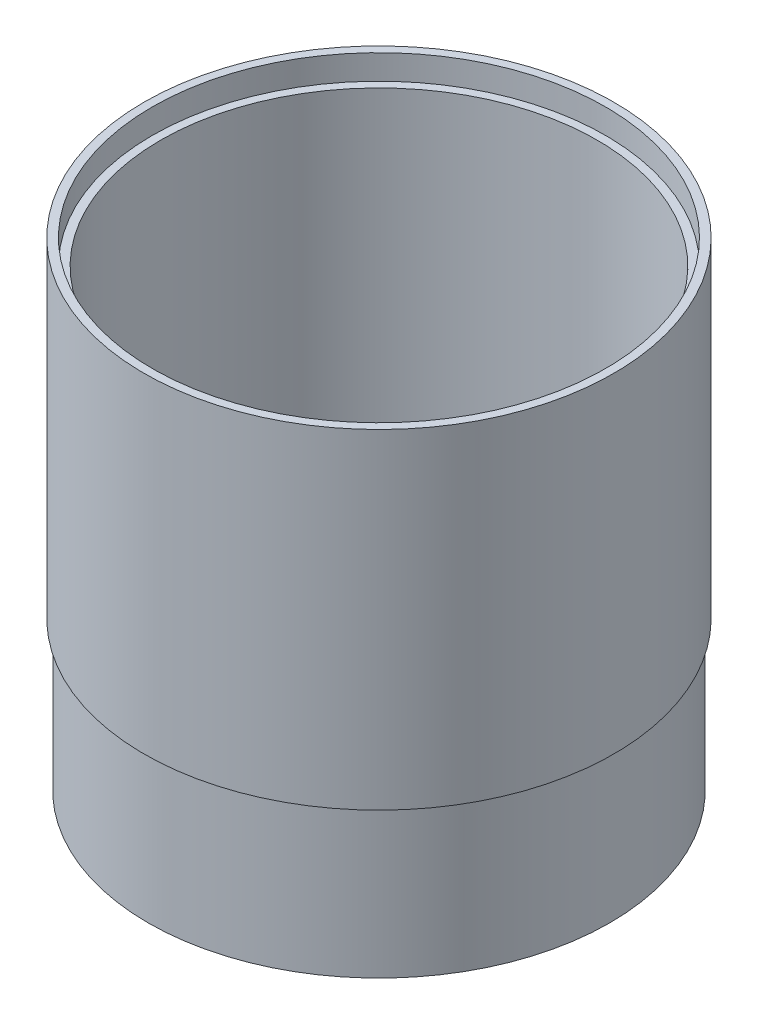
ISO-10303-21;
HEADER;
FILE_DESCRIPTION(('STEP AP214'),'2;1');
FILE_NAME('part.step','',(''),(''),'','','');
FILE_SCHEMA(('AUTOMOTIVE_DESIGN { 1 0 10303 214 1 1 1 1 }'));
ENDSEC;
DATA;
#1=APPLICATION_CONTEXT('core data for automotive mechanical design processes');
#2=APPLICATION_PROTOCOL_DEFINITION('international standard','automotive_design',2000,#1);
#3=PRODUCT_CONTEXT('',#1,'mechanical');
#4=PRODUCT('Part','Part','',(#3));
#5=PRODUCT_RELATED_PRODUCT_CATEGORY('part','',(#4));
#6=PRODUCT_DEFINITION_FORMATION('','',#4);
#7=PRODUCT_DEFINITION_CONTEXT('part definition',#1,'design');
#8=PRODUCT_DEFINITION('design','',#6,#7);
#9=PRODUCT_DEFINITION_SHAPE('','',#8);
#10=(LENGTH_UNIT() NAMED_UNIT(*) SI_UNIT(.MILLI.,.METRE.));
#11=(NAMED_UNIT(*) PLANE_ANGLE_UNIT() SI_UNIT($,.RADIAN.));
#12=(NAMED_UNIT(*) SI_UNIT($,.STERADIAN.) SOLID_ANGLE_UNIT());
#13=UNCERTAINTY_MEASURE_WITH_UNIT(LENGTH_MEASURE(1.E-05),#10,'distance_accuracy_value','');
#14=(GEOMETRIC_REPRESENTATION_CONTEXT(3) GLOBAL_UNCERTAINTY_ASSIGNED_CONTEXT((#13)) GLOBAL_UNIT_ASSIGNED_CONTEXT((#10,
#11,#12)) REPRESENTATION_CONTEXT('',''));
#15=CARTESIAN_POINT('',(0.,0.,0.));
#16=DIRECTION('',(0.,0.,1.));
#17=DIRECTION('',(1.,0.,0.));
#18=AXIS2_PLACEMENT_3D('',#15,#16,#17);
#19=CARTESIAN_POINT('',(0.,-0.9,0.));
#20=DIRECTION('',(0.,1.,0.));
#21=DIRECTION('',(1.,0.,0.));
#22=AXIS2_PLACEMENT_3D('',#19,#20,#21);
#23=CYLINDRICAL_SURFACE('',#22,28.);
#24=CARTESIAN_POINT('',(0.,18.,0.));
#25=DIRECTION('',(0.,-1.,0.));
#26=DIRECTION('',(1.,0.,0.));
#27=AXIS2_PLACEMENT_3D('',#24,#25,#26);
#28=CIRCLE('',#27,28.);
#29=CARTESIAN_POINT('',(-28.,18.,0.));
#30=VERTEX_POINT('',#29);
#31=EDGE_CURVE('E28',#30,#30,#28,.T.);
#32=ORIENTED_EDGE('',*,*,#31,.T.);
#33=DIRECTION('',(0.,-1.,0.));
#34=VECTOR('',#33,1.);
#35=CARTESIAN_POINT('',(-28.,-0.9,0.));
#36=LINE('',#35,#34);
#37=CARTESIAN_POINT('',(-28.,0.,0.));
#38=VERTEX_POINT('',#37);
#39=EDGE_CURVE('E11',#30,#38,#36,.T.);
#40=ORIENTED_EDGE('',*,*,#39,.T.);
#41=CARTESIAN_POINT('',(0.,0.,0.));
#42=DIRECTION('',(0.,1.,0.));
#43=DIRECTION('',(1.,0.,0.));
#44=AXIS2_PLACEMENT_3D('',#41,#42,#43);
#45=CIRCLE('',#44,28.);
#46=EDGE_CURVE('E21',#38,#38,#45,.T.);
#47=ORIENTED_EDGE('',*,*,#46,.T.);
#48=ORIENTED_EDGE('',*,*,#39,.F.);
#49=EDGE_LOOP('',(#32,#40,#47,#48));
#50=FACE_BOUND('',#49,.T.);
#51=ADVANCED_FACE('F17',(#50),#23,.T.);
#52=CARTESIAN_POINT('',(0.,18.,0.));
#53=DIRECTION('',(0.,1.,0.));
#54=DIRECTION('',(1.,0.,0.));
#55=AXIS2_PLACEMENT_3D('',#52,#53,#54);
#56=PLANE('',#55);
#57=ORIENTED_EDGE('',*,*,#31,.F.);
#58=EDGE_LOOP('',(#57));
#59=FACE_BOUND('',#58,.T.);
#60=CARTESIAN_POINT('',(0.,18.,0.));
#61=DIRECTION('',(0.,1.,0.));
#62=DIRECTION('',(1.,0.,0.));
#63=AXIS2_PLACEMENT_3D('',#60,#61,#62);
#64=CIRCLE('',#63,28.5);
#65=CARTESIAN_POINT('',(-28.5,18.,0.));
#66=VERTEX_POINT('',#65);
#67=EDGE_CURVE('E82',#66,#66,#64,.T.);
#68=ORIENTED_EDGE('',*,*,#67,.F.);
#69=EDGE_LOOP('',(#68));
#70=FACE_BOUND('',#69,.T.);
#71=ADVANCED_FACE('F113',(#59,#70),#56,.F.);
#72=CARTESIAN_POINT('',(0.,-2.9,0.));
#73=DIRECTION('',(0.,1.,0.));
#74=DIRECTION('',(1.,0.,0.));
#75=AXIS2_PLACEMENT_3D('',#72,#73,#74);
#76=CYLINDRICAL_SURFACE('',#75,28.5);
#77=CARTESIAN_POINT('',(0.,58.,0.));
#78=DIRECTION('',(0.,1.,0.));
#79=DIRECTION('',(1.,0.,0.));
#80=AXIS2_PLACEMENT_3D('',#77,#78,#79);
#81=CIRCLE('',#80,28.5);
#82=CARTESIAN_POINT('',(-28.5,58.,0.));
#83=VERTEX_POINT('',#82);
#84=EDGE_CURVE('E80',#83,#83,#81,.T.);
#85=ORIENTED_EDGE('',*,*,#84,.F.);
#86=DIRECTION('',(0.,-1.,0.));
#87=VECTOR('',#86,1.);
#88=CARTESIAN_POINT('',(-28.5,-2.9,0.));
#89=LINE('',#88,#87);
#90=EDGE_CURVE('E77',#83,#66,#89,.T.);
#91=ORIENTED_EDGE('',*,*,#90,.T.);
#92=ORIENTED_EDGE('',*,*,#67,.T.);
#93=ORIENTED_EDGE('',*,*,#90,.F.);
#94=EDGE_LOOP('',(#85,#91,#92,#93));
#95=FACE_BOUND('',#94,.T.);
#96=ADVANCED_FACE('F79',(#95),#76,.T.);
#97=CARTESIAN_POINT('',(0.,58.,0.));
#98=DIRECTION('',(0.,1.,0.));
#99=DIRECTION('',(1.,0.,0.));
#100=AXIS2_PLACEMENT_3D('',#97,#98,#99);
#101=PLANE('',#100);
#102=CARTESIAN_POINT('',(0.,58.,0.));
#103=DIRECTION('',(0.,1.,0.));
#104=DIRECTION('',(1.,0.,0.));
#105=AXIS2_PLACEMENT_3D('',#102,#103,#104);
#106=CIRCLE('',#105,27.5);
#107=CARTESIAN_POINT('',(-27.5,58.,0.));
#108=VERTEX_POINT('',#107);
#109=EDGE_CURVE('E88',#108,#108,#106,.T.);
#110=ORIENTED_EDGE('',*,*,#109,.F.);
#111=EDGE_LOOP('',(#110));
#112=FACE_BOUND('',#111,.T.);
#113=ORIENTED_EDGE('',*,*,#84,.T.);
#114=EDGE_LOOP('',(#113));
#115=FACE_BOUND('',#114,.T.);
#116=ADVANCED_FACE('F86',(#112,#115),#101,.T.);
#117=CARTESIAN_POINT('',(0.,-2.9,0.));
#118=DIRECTION('',(0.,1.,0.));
#119=DIRECTION('',(1.,0.,0.));
#120=AXIS2_PLACEMENT_3D('',#117,#118,#119);
#121=CYLINDRICAL_SURFACE('',#120,27.5);
#122=CARTESIAN_POINT('',(0.,55.,0.));
#123=DIRECTION('',(0.,1.,0.));
#124=DIRECTION('',(1.,0.,0.));
#125=AXIS2_PLACEMENT_3D('',#122,#123,#124);
#126=CIRCLE('',#125,27.5);
#127=CARTESIAN_POINT('',(-27.5,55.,0.));
#128=VERTEX_POINT('',#127);
#129=EDGE_CURVE('E96',#128,#128,#126,.T.);
#130=ORIENTED_EDGE('',*,*,#129,.F.);
#131=DIRECTION('',(0.,1.,0.));
#132=VECTOR('',#131,1.);
#133=CARTESIAN_POINT('',(-27.5,-2.9,0.));
#134=LINE('',#133,#132);
#135=EDGE_CURVE('E57',#128,#108,#134,.T.);
#136=ORIENTED_EDGE('',*,*,#135,.T.);
#137=ORIENTED_EDGE('',*,*,#109,.T.);
#138=ORIENTED_EDGE('',*,*,#135,.F.);
#139=EDGE_LOOP('',(#130,#136,#137,#138));
#140=FACE_BOUND('',#139,.T.);
#141=ADVANCED_FACE('F19',(#140),#121,.F.);
#142=CARTESIAN_POINT('',(0.,55.,0.));
#143=DIRECTION('',(0.,1.,0.));
#144=DIRECTION('',(1.,0.,0.));
#145=AXIS2_PLACEMENT_3D('',#142,#143,#144);
#146=PLANE('',#145);
#147=CARTESIAN_POINT('',(0.,55.,0.));
#148=DIRECTION('',(0.,1.,0.));
#149=DIRECTION('',(1.,0.,0.));
#150=AXIS2_PLACEMENT_3D('',#147,#148,#149);
#151=CIRCLE('',#150,26.5);
#152=CARTESIAN_POINT('',(-26.5,55.,0.));
#153=VERTEX_POINT('',#152);
#154=EDGE_CURVE('E69',#153,#153,#151,.T.);
#155=ORIENTED_EDGE('',*,*,#154,.F.);
#156=EDGE_LOOP('',(#155));
#157=FACE_BOUND('',#156,.T.);
#158=ORIENTED_EDGE('',*,*,#129,.T.);
#159=EDGE_LOOP('',(#158));
#160=FACE_BOUND('',#159,.T.);
#161=ADVANCED_FACE('F124',(#157,#160),#146,.T.);
#162=CARTESIAN_POINT('',(0.,-2.9,0.));
#163=DIRECTION('',(0.,1.,0.));
#164=DIRECTION('',(1.,0.,0.));
#165=AXIS2_PLACEMENT_3D('',#162,#163,#164);
#166=CYLINDRICAL_SURFACE('',#165,26.5);
#167=CARTESIAN_POINT('',(0.,0.,0.));
#168=DIRECTION('',(0.,1.,0.));
#169=DIRECTION('',(1.,0.,0.));
#170=AXIS2_PLACEMENT_3D('',#167,#168,#169);
#171=CIRCLE('',#170,26.5);
#172=CARTESIAN_POINT('',(-26.5,0.,0.));
#173=VERTEX_POINT('',#172);
#174=EDGE_CURVE('E103',#173,#173,#171,.T.);
#175=ORIENTED_EDGE('',*,*,#174,.F.);
#176=DIRECTION('',(0.,1.,0.));
#177=VECTOR('',#176,1.);
#178=CARTESIAN_POINT('',(-26.5,-2.9,0.));
#179=LINE('',#178,#177);
#180=EDGE_CURVE('E101',#173,#153,#179,.T.);
#181=ORIENTED_EDGE('',*,*,#180,.T.);
#182=ORIENTED_EDGE('',*,*,#154,.T.);
#183=ORIENTED_EDGE('',*,*,#180,.F.);
#184=EDGE_LOOP('',(#175,#181,#182,#183));
#185=FACE_BOUND('',#184,.T.);
#186=ADVANCED_FACE('F127',(#185),#166,.F.);
#187=CARTESIAN_POINT('',(0.,0.,0.));
#188=DIRECTION('',(0.,1.,0.));
#189=DIRECTION('',(1.,0.,0.));
#190=AXIS2_PLACEMENT_3D('',#187,#188,#189);
#191=PLANE('',#190);
#192=ORIENTED_EDGE('',*,*,#174,.T.);
#193=EDGE_LOOP('',(#192));
#194=FACE_BOUND('',#193,.T.);
#195=ORIENTED_EDGE('',*,*,#46,.F.);
#196=EDGE_LOOP('',(#195));
#197=FACE_BOUND('',#196,.T.);
#198=ADVANCED_FACE('F130',(#194,#197),#191,.F.);
#199=CLOSED_SHELL('',(#51,#71,#96,#116,#141,#161,#186,#198));
#200=MANIFOLD_SOLID_BREP('B1',#199);
#201=ADVANCED_BREP_SHAPE_REPRESENTATION('',(#18,#200),#14);
#202=SHAPE_DEFINITION_REPRESENTATION(#9,#201);
ENDSEC;
END-ISO-10303-21;
